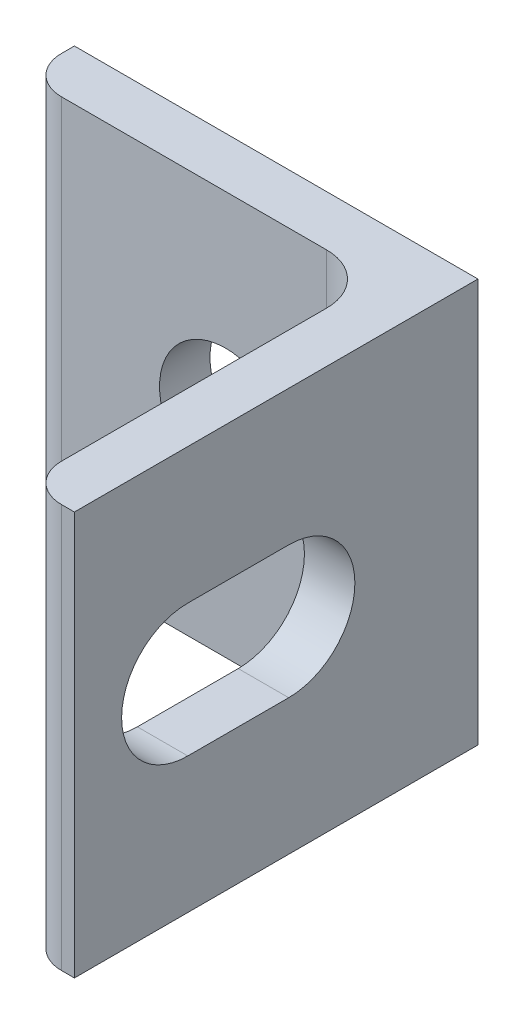
ISO-10303-21;
HEADER;
FILE_DESCRIPTION(('STEP AP214'),'2;1');
FILE_NAME('part.step','',(''),(''),'','','');
FILE_SCHEMA(('AUTOMOTIVE_DESIGN { 1 0 10303 214 1 1 1 1 }'));
ENDSEC;
DATA;
#1=APPLICATION_CONTEXT('core data for automotive mechanical design processes');
#2=APPLICATION_PROTOCOL_DEFINITION('international standard','automotive_design',2000,#1);
#3=PRODUCT_CONTEXT('',#1,'mechanical');
#4=PRODUCT('Part','Part','',(#3));
#5=PRODUCT_RELATED_PRODUCT_CATEGORY('part','',(#4));
#6=PRODUCT_DEFINITION_FORMATION('','',#4);
#7=PRODUCT_DEFINITION_CONTEXT('part definition',#1,'design');
#8=PRODUCT_DEFINITION('design','',#6,#7);
#9=PRODUCT_DEFINITION_SHAPE('','',#8);
#10=(LENGTH_UNIT() NAMED_UNIT(*) SI_UNIT(.MILLI.,.METRE.));
#11=(NAMED_UNIT(*) PLANE_ANGLE_UNIT() SI_UNIT($,.RADIAN.));
#12=(NAMED_UNIT(*) SI_UNIT($,.STERADIAN.) SOLID_ANGLE_UNIT());
#13=UNCERTAINTY_MEASURE_WITH_UNIT(LENGTH_MEASURE(1.E-05),#10,'distance_accuracy_value','');
#14=(GEOMETRIC_REPRESENTATION_CONTEXT(3) GLOBAL_UNCERTAINTY_ASSIGNED_CONTEXT((#13)) GLOBAL_UNIT_ASSIGNED_CONTEXT((#10,
#11,#12)) REPRESENTATION_CONTEXT('',''));
#15=CARTESIAN_POINT('',(0.,0.,0.));
#16=DIRECTION('',(0.,0.,1.));
#17=DIRECTION('',(1.,0.,0.));
#18=AXIS2_PLACEMENT_3D('',#15,#16,#17);
#19=CARTESIAN_POINT('',(-25.4,0.,25.4));
#20=DIRECTION('',(0.,0.,1.));
#21=DIRECTION('',(1.,0.,0.));
#22=AXIS2_PLACEMENT_3D('',#19,#20,#21);
#23=PLANE('',#22);
#24=DIRECTION('',(1.,0.,0.));
#25=VECTOR('',#24,1.);
#26=CARTESIAN_POINT('',(-25.4,0.,25.4));
#27=LINE('',#26,#25);
#28=CARTESIAN_POINT('',(-0.812799999999999,0.,25.4));
#29=VERTEX_POINT('',#28);
#30=CARTESIAN_POINT('',(0.,0.,25.4));
#31=VERTEX_POINT('',#30);
#32=EDGE_CURVE('E192',#29,#31,#27,.T.);
#33=ORIENTED_EDGE('',*,*,#32,.F.);
#34=DIRECTION('',(0.,-1.,0.));
#35=VECTOR('',#34,1.);
#36=CARTESIAN_POINT('',(-0.812799999999999,-25.4,25.4));
#37=LINE('',#36,#35);
#38=CARTESIAN_POINT('',(-0.812799999999999,-25.4,25.4));
#39=VERTEX_POINT('',#38);
#40=EDGE_CURVE('E222',#29,#39,#37,.T.);
#41=ORIENTED_EDGE('',*,*,#40,.T.);
#42=DIRECTION('',(1.,0.,0.));
#43=VECTOR('',#42,1.);
#44=CARTESIAN_POINT('',(-25.4,-25.4,25.4));
#45=LINE('',#44,#43);
#46=CARTESIAN_POINT('',(0.,-25.4,25.4));
#47=VERTEX_POINT('',#46);
#48=EDGE_CURVE('E181',#39,#47,#45,.T.);
#49=ORIENTED_EDGE('',*,*,#48,.T.);
#50=DIRECTION('',(0.,-1.,0.));
#51=VECTOR('',#50,1.);
#52=CARTESIAN_POINT('',(0.,0.,25.4));
#53=LINE('',#52,#51);
#54=EDGE_CURVE('E169',#31,#47,#53,.T.);
#55=ORIENTED_EDGE('',*,*,#54,.F.);
#56=EDGE_LOOP('',(#33,#41,#49,#55));
#57=FACE_BOUND('',#56,.T.);
#58=ADVANCED_FACE('F33',(#57),#23,.T.);
#59=CARTESIAN_POINT('',(-25.4,0.,0.));
#60=DIRECTION('',(0.,1.,0.));
#61=DIRECTION('',(0.,0.,1.));
#62=AXIS2_PLACEMENT_3D('',#59,#60,#61);
#63=PLANE('',#62);
#64=DIRECTION('',(0.,0.,1.));
#65=VECTOR('',#64,1.);
#66=CARTESIAN_POINT('',(-25.4,0.,0.));
#67=LINE('',#66,#65);
#68=CARTESIAN_POINT('',(-25.4,0.,0.));
#69=VERTEX_POINT('',#68);
#70=CARTESIAN_POINT('',(-25.4,0.,0.8128));
#71=VERTEX_POINT('',#70);
#72=EDGE_CURVE('E178',#69,#71,#67,.T.);
#73=ORIENTED_EDGE('',*,*,#72,.T.);
#74=CARTESIAN_POINT('',(-23.0378,0.,0.8128));
#75=DIRECTION('',(0.,1.,0.));
#76=DIRECTION('',(0.,0.,1.));
#77=AXIS2_PLACEMENT_3D('',#74,#75,#76);
#78=CIRCLE('',#77,2.3622);
#79=CARTESIAN_POINT('',(-23.0378,0.,3.175));
#80=VERTEX_POINT('',#79);
#81=EDGE_CURVE('E220',#71,#80,#78,.T.);
#82=ORIENTED_EDGE('',*,*,#81,.T.);
#83=DIRECTION('',(1.,0.,0.));
#84=VECTOR('',#83,1.);
#85=CARTESIAN_POINT('',(-25.4,0.,3.175));
#86=LINE('',#85,#84);
#87=CARTESIAN_POINT('',(-6.35000000000009,0.,3.175));
#88=VERTEX_POINT('',#87);
#89=EDGE_CURVE('E164',#80,#88,#86,.T.);
#90=ORIENTED_EDGE('',*,*,#89,.T.);
#91=CARTESIAN_POINT('',(-6.35000000000009,0.,6.35));
#92=DIRECTION('',(0.,1.,0.));
#93=DIRECTION('',(0.,0.,1.));
#94=AXIS2_PLACEMENT_3D('',#91,#92,#93);
#95=CIRCLE('',#94,3.175);
#96=CARTESIAN_POINT('',(-3.17500000000009,0.,6.34999999999998));
#97=VERTEX_POINT('',#96);
#98=EDGE_CURVE('E11',#88,#97,#95,.F.);
#99=ORIENTED_EDGE('',*,*,#98,.T.);
#100=DIRECTION('',(0.,0.,1.));
#101=VECTOR('',#100,1.);
#102=CARTESIAN_POINT('',(-3.17500000000011,0.,3.175));
#103=LINE('',#102,#101);
#104=CARTESIAN_POINT('',(-3.175,0.,23.0378));
#105=VERTEX_POINT('',#104);
#106=EDGE_CURVE('E166',#97,#105,#103,.T.);
#107=ORIENTED_EDGE('',*,*,#106,.T.);
#108=CARTESIAN_POINT('',(-0.812799999999999,0.,23.0378));
#109=DIRECTION('',(0.,1.,0.));
#110=DIRECTION('',(0.,0.,1.));
#111=AXIS2_PLACEMENT_3D('',#108,#109,#110);
#112=CIRCLE('',#111,2.3622);
#113=EDGE_CURVE('E218',#105,#29,#112,.T.);
#114=ORIENTED_EDGE('',*,*,#113,.T.);
#115=ORIENTED_EDGE('',*,*,#32,.T.);
#116=DIRECTION('',(0.,0.,1.));
#117=VECTOR('',#116,1.);
#118=CARTESIAN_POINT('',(0.,0.,0.));
#119=LINE('',#118,#117);
#120=CARTESIAN_POINT('',(0.,0.,0.));
#121=VERTEX_POINT('',#120);
#122=EDGE_CURVE('E175',#121,#31,#119,.T.);
#123=ORIENTED_EDGE('',*,*,#122,.F.);
#124=DIRECTION('',(1.,0.,0.));
#125=VECTOR('',#124,1.);
#126=CARTESIAN_POINT('',(-25.4,0.,0.));
#127=LINE('',#126,#125);
#128=EDGE_CURVE('E195',#69,#121,#127,.T.);
#129=ORIENTED_EDGE('',*,*,#128,.F.);
#130=EDGE_LOOP('',(#73,#82,#90,#99,#107,#114,#115,#123,#129));
#131=FACE_BOUND('',#130,.T.);
#132=ADVANCED_FACE('F247',(#131),#63,.T.);
#133=CARTESIAN_POINT('',(-25.4,-25.4,0.));
#134=DIRECTION('',(0.,0.,-1.));
#135=DIRECTION('',(0.,1.,0.));
#136=AXIS2_PLACEMENT_3D('',#133,#134,#135);
#137=PLANE('',#136);
#138=CARTESIAN_POINT('',(-12.7,-12.7,0.));
#139=DIRECTION('',(0.,0.,1.));
#140=DIRECTION('',(1.,0.,0.));
#141=AXIS2_PLACEMENT_3D('',#138,#139,#140);
#142=CIRCLE('',#141,4.16560000000001);
#143=CARTESIAN_POINT('',(-8.53439999999999,-12.7,0.));
#144=VERTEX_POINT('',#143);
#145=EDGE_CURVE('E318',#144,#144,#142,.T.);
#146=ORIENTED_EDGE('',*,*,#145,.T.);
#147=EDGE_LOOP('',(#146));
#148=FACE_BOUND('',#147,.T.);
#149=DIRECTION('',(0.,1.,0.));
#150=VECTOR('',#149,1.);
#151=CARTESIAN_POINT('',(0.,-25.4,0.));
#152=LINE('',#151,#150);
#153=CARTESIAN_POINT('',(0.,-25.4,0.));
#154=VERTEX_POINT('',#153);
#155=EDGE_CURVE('E187',#154,#121,#152,.T.);
#156=ORIENTED_EDGE('',*,*,#155,.F.);
#157=DIRECTION('',(1.,0.,0.));
#158=VECTOR('',#157,1.);
#159=CARTESIAN_POINT('',(-25.4,-25.4,0.));
#160=LINE('',#159,#158);
#161=CARTESIAN_POINT('',(-25.4,-25.4,0.));
#162=VERTEX_POINT('',#161);
#163=EDGE_CURVE('E197',#162,#154,#160,.T.);
#164=ORIENTED_EDGE('',*,*,#163,.F.);
#165=DIRECTION('',(0.,1.,0.));
#166=VECTOR('',#165,1.);
#167=CARTESIAN_POINT('',(-25.4,-25.4,0.));
#168=LINE('',#167,#166);
#169=EDGE_CURVE('E174',#162,#69,#168,.T.);
#170=ORIENTED_EDGE('',*,*,#169,.T.);
#171=ORIENTED_EDGE('',*,*,#128,.T.);
#172=EDGE_LOOP('',(#156,#164,#170,#171));
#173=FACE_BOUND('',#172,.T.);
#174=ADVANCED_FACE('F257',(#148,#173),#137,.T.);
#175=CARTESIAN_POINT('',(-25.4,-25.4,25.4));
#176=DIRECTION('',(0.,-1.,0.));
#177=DIRECTION('',(0.,0.,-1.));
#178=AXIS2_PLACEMENT_3D('',#175,#176,#177);
#179=PLANE('',#178);
#180=DIRECTION('',(1.,0.,0.));
#181=VECTOR('',#180,1.);
#182=CARTESIAN_POINT('',(-25.4,-25.4,3.175));
#183=LINE('',#182,#181);
#184=CARTESIAN_POINT('',(-23.0378,-25.4,3.175));
#185=VERTEX_POINT('',#184);
#186=CARTESIAN_POINT('',(-6.35000000000009,-25.4,3.175));
#187=VERTEX_POINT('',#186);
#188=EDGE_CURVE('E161',#185,#187,#183,.T.);
#189=ORIENTED_EDGE('',*,*,#188,.F.);
#190=CARTESIAN_POINT('',(-23.0378,-25.4,0.8128));
#191=DIRECTION('',(0.,-1.,0.));
#192=DIRECTION('',(0.,0.,-1.));
#193=AXIS2_PLACEMENT_3D('',#190,#191,#192);
#194=CIRCLE('',#193,2.3622);
#195=CARTESIAN_POINT('',(-25.4,-25.4,0.812799999999999));
#196=VERTEX_POINT('',#195);
#197=EDGE_CURVE('E214',#185,#196,#194,.T.);
#198=ORIENTED_EDGE('',*,*,#197,.T.);
#199=DIRECTION('',(0.,0.,-1.));
#200=VECTOR('',#199,1.);
#201=CARTESIAN_POINT('',(-25.4,-25.4,25.4));
#202=LINE('',#201,#200);
#203=EDGE_CURVE('E172',#196,#162,#202,.T.);
#204=ORIENTED_EDGE('',*,*,#203,.T.);
#205=ORIENTED_EDGE('',*,*,#163,.T.);
#206=DIRECTION('',(0.,0.,-1.));
#207=VECTOR('',#206,1.);
#208=CARTESIAN_POINT('',(0.,-25.4,25.4));
#209=LINE('',#208,#207);
#210=EDGE_CURVE('E184',#47,#154,#209,.T.);
#211=ORIENTED_EDGE('',*,*,#210,.F.);
#212=ORIENTED_EDGE('',*,*,#48,.F.);
#213=CARTESIAN_POINT('',(-0.812799999999999,-25.4,23.0378));
#214=DIRECTION('',(0.,-1.,0.));
#215=DIRECTION('',(0.,0.,-1.));
#216=AXIS2_PLACEMENT_3D('',#213,#214,#215);
#217=CIRCLE('',#216,2.3622);
#218=CARTESIAN_POINT('',(-3.175,-25.4,23.0378));
#219=VERTEX_POINT('',#218);
#220=EDGE_CURVE('E211',#39,#219,#217,.T.);
#221=ORIENTED_EDGE('',*,*,#220,.T.);
#222=DIRECTION('',(0.,0.,1.));
#223=VECTOR('',#222,1.);
#224=CARTESIAN_POINT('',(-3.17500000000011,-25.4,3.175));
#225=LINE('',#224,#223);
#226=CARTESIAN_POINT('',(-3.17500000000009,-25.4,6.34999999999998));
#227=VERTEX_POINT('',#226);
#228=EDGE_CURVE('E167',#227,#219,#225,.T.);
#229=ORIENTED_EDGE('',*,*,#228,.F.);
#230=CARTESIAN_POINT('',(-6.35000000000009,-25.4,6.35));
#231=DIRECTION('',(0.,-1.,0.));
#232=DIRECTION('',(0.,0.,-1.));
#233=AXIS2_PLACEMENT_3D('',#230,#231,#232);
#234=CIRCLE('',#233,3.175);
#235=EDGE_CURVE('E41',#227,#187,#234,.F.);
#236=ORIENTED_EDGE('',*,*,#235,.T.);
#237=EDGE_LOOP('',(#189,#198,#204,#205,#211,#212,#221,#229,#236));
#238=FACE_BOUND('',#237,.T.);
#239=ADVANCED_FACE('F237',(#238),#179,.T.);
#240=CARTESIAN_POINT('',(-25.4,-25.4,25.4));
#241=DIRECTION('',(1.,0.,0.));
#242=DIRECTION('',(0.,0.,-1.));
#243=AXIS2_PLACEMENT_3D('',#240,#241,#242);
#244=PLANE('',#243);
#245=ORIENTED_EDGE('',*,*,#203,.F.);
#246=DIRECTION('',(0.,-1.,0.));
#247=VECTOR('',#246,1.);
#248=CARTESIAN_POINT('',(-25.4,-25.4,0.812799999999999));
#249=LINE('',#248,#247);
#250=EDGE_CURVE('E216',#196,#71,#249,.F.);
#251=ORIENTED_EDGE('',*,*,#250,.T.);
#252=ORIENTED_EDGE('',*,*,#72,.F.);
#253=ORIENTED_EDGE('',*,*,#169,.F.);
#254=EDGE_LOOP('',(#245,#251,#252,#253));
#255=FACE_BOUND('',#254,.T.);
#256=ADVANCED_FACE('F260',(#255),#244,.F.);
#257=CARTESIAN_POINT('',(0.,-25.4,25.4));
#258=DIRECTION('',(1.,0.,0.));
#259=DIRECTION('',(0.,0.,-1.));
#260=AXIS2_PLACEMENT_3D('',#257,#258,#259);
#261=PLANE('',#260);
#262=CARTESIAN_POINT('',(0.,-12.7,18.2626));
#263=DIRECTION('',(1.,0.,0.));
#264=DIRECTION('',(0.,1.,0.));
#265=AXIS2_PLACEMENT_3D('',#262,#263,#264);
#266=CIRCLE('',#265,4.1656);
#267=CARTESIAN_POINT('',(0.,-8.5344,18.2626));
#268=VERTEX_POINT('',#267);
#269=CARTESIAN_POINT('',(0.,-16.8656,18.2626));
#270=VERTEX_POINT('',#269);
#271=EDGE_CURVE('E149',#268,#270,#266,.T.);
#272=ORIENTED_EDGE('',*,*,#271,.F.);
#273=DIRECTION('',(0.,0.,1.));
#274=VECTOR('',#273,1.);
#275=CARTESIAN_POINT('',(0.,-8.5344,11.9126));
#276=LINE('',#275,#274);
#277=CARTESIAN_POINT('',(0.,-8.5344,11.9126));
#278=VERTEX_POINT('',#277);
#279=EDGE_CURVE('E154',#278,#268,#276,.T.);
#280=ORIENTED_EDGE('',*,*,#279,.F.);
#281=CARTESIAN_POINT('',(0.,-12.7,11.9126));
#282=DIRECTION('',(1.,0.,0.));
#283=DIRECTION('',(0.,1.,0.));
#284=AXIS2_PLACEMENT_3D('',#281,#282,#283);
#285=CIRCLE('',#284,4.1656);
#286=CARTESIAN_POINT('',(0.,-16.8656,11.9126));
#287=VERTEX_POINT('',#286);
#288=EDGE_CURVE('E133',#287,#278,#285,.T.);
#289=ORIENTED_EDGE('',*,*,#288,.F.);
#290=DIRECTION('',(0.,0.,-1.));
#291=VECTOR('',#290,1.);
#292=CARTESIAN_POINT('',(0.,-16.8656,18.2626));
#293=LINE('',#292,#291);
#294=EDGE_CURVE('E144',#270,#287,#293,.T.);
#295=ORIENTED_EDGE('',*,*,#294,.F.);
#296=EDGE_LOOP('',(#272,#280,#289,#295));
#297=FACE_BOUND('',#296,.T.);
#298=ORIENTED_EDGE('',*,*,#54,.T.);
#299=ORIENTED_EDGE('',*,*,#210,.T.);
#300=ORIENTED_EDGE('',*,*,#155,.T.);
#301=ORIENTED_EDGE('',*,*,#122,.T.);
#302=EDGE_LOOP('',(#298,#299,#300,#301));
#303=FACE_BOUND('',#302,.T.);
#304=ADVANCED_FACE('F151',(#297,#303),#261,.T.);
#305=CARTESIAN_POINT('',(-3.17500000000011,0.,3.175));
#306=DIRECTION('',(1.,0.,0.));
#307=DIRECTION('',(0.,0.,-1.));
#308=AXIS2_PLACEMENT_3D('',#305,#306,#307);
#309=PLANE('',#308);
#310=DIRECTION('',(0.,0.,1.));
#311=VECTOR('',#310,1.);
#312=CARTESIAN_POINT('',(-3.17500000000011,-8.5344,3.175));
#313=LINE('',#312,#311);
#314=CARTESIAN_POINT('',(-3.17500000000008,-8.5344,11.9126));
#315=VERTEX_POINT('',#314);
#316=CARTESIAN_POINT('',(-3.17500000000004,-8.5344,18.2626));
#317=VERTEX_POINT('',#316);
#318=EDGE_CURVE('E202',#315,#317,#313,.T.);
#319=ORIENTED_EDGE('',*,*,#318,.T.);
#320=CARTESIAN_POINT('',(-3.17500000000003,-12.7,18.2626));
#321=DIRECTION('',(1.,0.,0.));
#322=DIRECTION('',(0.,0.,-1.));
#323=AXIS2_PLACEMENT_3D('',#320,#321,#322);
#324=CIRCLE('',#323,4.1656);
#325=CARTESIAN_POINT('',(-3.17500000000004,-16.8656,18.2626));
#326=VERTEX_POINT('',#325);
#327=EDGE_CURVE('E205',#317,#326,#324,.T.);
#328=ORIENTED_EDGE('',*,*,#327,.T.);
#329=DIRECTION('',(0.,0.,-1.));
#330=VECTOR('',#329,1.);
#331=CARTESIAN_POINT('',(-3.17500000000011,-16.8656,3.175));
#332=LINE('',#331,#330);
#333=CARTESIAN_POINT('',(-3.17500000000006,-16.8656,11.9126));
#334=VERTEX_POINT('',#333);
#335=EDGE_CURVE('E194',#326,#334,#332,.T.);
#336=ORIENTED_EDGE('',*,*,#335,.T.);
#337=CARTESIAN_POINT('',(-3.17500000000006,-12.7,11.9126));
#338=DIRECTION('',(1.,0.,0.));
#339=DIRECTION('',(0.,0.,-1.));
#340=AXIS2_PLACEMENT_3D('',#337,#338,#339);
#341=CIRCLE('',#340,4.1656);
#342=EDGE_CURVE('E136',#334,#315,#341,.T.);
#343=ORIENTED_EDGE('',*,*,#342,.T.);
#344=EDGE_LOOP('',(#319,#328,#336,#343));
#345=FACE_BOUND('',#344,.T.);
#346=ORIENTED_EDGE('',*,*,#106,.F.);
#347=DIRECTION('',(0.,-1.,0.));
#348=VECTOR('',#347,1.);
#349=CARTESIAN_POINT('',(-3.17500000000009,-25.4,6.34999999999998));
#350=LINE('',#349,#348);
#351=EDGE_CURVE('E228',#97,#227,#350,.T.);
#352=ORIENTED_EDGE('',*,*,#351,.T.);
#353=ORIENTED_EDGE('',*,*,#228,.T.);
#354=DIRECTION('',(0.,-1.,0.));
#355=VECTOR('',#354,1.);
#356=CARTESIAN_POINT('',(-3.175,0.,23.0378));
#357=LINE('',#356,#355);
#358=EDGE_CURVE('E225',#219,#105,#357,.F.);
#359=ORIENTED_EDGE('',*,*,#358,.T.);
#360=EDGE_LOOP('',(#346,#352,#353,#359));
#361=FACE_BOUND('',#360,.T.);
#362=ADVANCED_FACE('F234',(#345,#361),#309,.F.);
#363=CARTESIAN_POINT('',(-25.4,0.,3.175));
#364=DIRECTION('',(0.,0.,-1.));
#365=DIRECTION('',(-1.,0.,0.));
#366=AXIS2_PLACEMENT_3D('',#363,#364,#365);
#367=PLANE('',#366);
#368=CARTESIAN_POINT('',(-12.7,-12.7,3.175));
#369=DIRECTION('',(0.,0.,1.));
#370=DIRECTION('',(1.,0.,0.));
#371=AXIS2_PLACEMENT_3D('',#368,#369,#370);
#372=CIRCLE('',#371,4.16560000000001);
#373=CARTESIAN_POINT('',(-8.53439999999999,-12.7,3.175));
#374=VERTEX_POINT('',#373);
#375=EDGE_CURVE('E319',#374,#374,#372,.T.);
#376=ORIENTED_EDGE('',*,*,#375,.F.);
#377=EDGE_LOOP('',(#376));
#378=FACE_BOUND('',#377,.T.);
#379=ORIENTED_EDGE('',*,*,#188,.T.);
#380=DIRECTION('',(0.,-1.,0.));
#381=VECTOR('',#380,1.);
#382=CARTESIAN_POINT('',(-6.35000000000009,0.,3.175));
#383=LINE('',#382,#381);
#384=EDGE_CURVE('E54',#187,#88,#383,.F.);
#385=ORIENTED_EDGE('',*,*,#384,.T.);
#386=ORIENTED_EDGE('',*,*,#89,.F.);
#387=DIRECTION('',(0.,-1.,0.));
#388=VECTOR('',#387,1.);
#389=CARTESIAN_POINT('',(-23.0378,0.,3.175));
#390=LINE('',#389,#388);
#391=EDGE_CURVE('E208',#80,#185,#390,.T.);
#392=ORIENTED_EDGE('',*,*,#391,.T.);
#393=EDGE_LOOP('',(#379,#385,#386,#392));
#394=FACE_BOUND('',#393,.T.);
#395=ADVANCED_FACE('F265',(#378,#394),#367,.F.);
#396=CARTESIAN_POINT('',(-25.4,-12.7,18.2626));
#397=DIRECTION('',(1.,0.,0.));
#398=DIRECTION('',(0.,1.,0.));
#399=AXIS2_PLACEMENT_3D('',#396,#397,#398);
#400=CYLINDRICAL_SURFACE('',#399,4.1656);
#401=DIRECTION('',(1.,0.,0.));
#402=VECTOR('',#401,1.);
#403=CARTESIAN_POINT('',(-25.4,-8.5344,18.2626));
#404=LINE('',#403,#402);
#405=EDGE_CURVE('E159',#317,#268,#404,.T.);
#406=ORIENTED_EDGE('',*,*,#405,.T.);
#407=ORIENTED_EDGE('',*,*,#271,.T.);
#408=DIRECTION('',(1.,0.,0.));
#409=VECTOR('',#408,1.);
#410=CARTESIAN_POINT('',(-25.4,-16.8656,18.2626));
#411=LINE('',#410,#409);
#412=EDGE_CURVE('E140',#326,#270,#411,.T.);
#413=ORIENTED_EDGE('',*,*,#412,.F.);
#414=ORIENTED_EDGE('',*,*,#327,.F.);
#415=EDGE_LOOP('',(#406,#407,#413,#414));
#416=FACE_BOUND('',#415,.T.);
#417=ADVANCED_FACE('F296',(#416),#400,.F.);
#418=CARTESIAN_POINT('',(-25.4,-8.5344,11.9126));
#419=DIRECTION('',(0.,1.,0.));
#420=DIRECTION('',(-1.,0.,0.));
#421=AXIS2_PLACEMENT_3D('',#418,#419,#420);
#422=PLANE('',#421);
#423=DIRECTION('',(1.,0.,0.));
#424=VECTOR('',#423,1.);
#425=CARTESIAN_POINT('',(-25.4,-8.5344,11.9126));
#426=LINE('',#425,#424);
#427=EDGE_CURVE('E139',#315,#278,#426,.T.);
#428=ORIENTED_EDGE('',*,*,#427,.T.);
#429=ORIENTED_EDGE('',*,*,#279,.T.);
#430=ORIENTED_EDGE('',*,*,#405,.F.);
#431=ORIENTED_EDGE('',*,*,#318,.F.);
#432=EDGE_LOOP('',(#428,#429,#430,#431));
#433=FACE_BOUND('',#432,.T.);
#434=ADVANCED_FACE('F293',(#433),#422,.F.);
#435=CARTESIAN_POINT('',(-25.4,-12.7,11.9126));
#436=DIRECTION('',(1.,0.,0.));
#437=DIRECTION('',(0.,1.,0.));
#438=AXIS2_PLACEMENT_3D('',#435,#436,#437);
#439=CYLINDRICAL_SURFACE('',#438,4.1656);
#440=DIRECTION('',(1.,0.,0.));
#441=VECTOR('',#440,1.);
#442=CARTESIAN_POINT('',(-25.4,-16.8656,11.9126));
#443=LINE('',#442,#441);
#444=EDGE_CURVE('E128',#334,#287,#443,.T.);
#445=ORIENTED_EDGE('',*,*,#444,.T.);
#446=ORIENTED_EDGE('',*,*,#288,.T.);
#447=ORIENTED_EDGE('',*,*,#427,.F.);
#448=ORIENTED_EDGE('',*,*,#342,.F.);
#449=EDGE_LOOP('',(#445,#446,#447,#448));
#450=FACE_BOUND('',#449,.T.);
#451=ADVANCED_FACE('F130',(#450),#439,.F.);
#452=CARTESIAN_POINT('',(-25.4,-16.8656,18.2626));
#453=DIRECTION('',(0.,-1.,0.));
#454=DIRECTION('',(1.,0.,0.));
#455=AXIS2_PLACEMENT_3D('',#452,#453,#454);
#456=PLANE('',#455);
#457=ORIENTED_EDGE('',*,*,#412,.T.);
#458=ORIENTED_EDGE('',*,*,#294,.T.);
#459=ORIENTED_EDGE('',*,*,#444,.F.);
#460=ORIENTED_EDGE('',*,*,#335,.F.);
#461=EDGE_LOOP('',(#457,#458,#459,#460));
#462=FACE_BOUND('',#461,.T.);
#463=ADVANCED_FACE('F145',(#462),#456,.F.);
#464=CARTESIAN_POINT('',(-12.7,-12.7,3.175));
#465=DIRECTION('',(0.,0.,1.));
#466=DIRECTION('',(1.,0.,0.));
#467=AXIS2_PLACEMENT_3D('',#464,#465,#466);
#468=CYLINDRICAL_SURFACE('',#467,4.16560000000001);
#469=ORIENTED_EDGE('',*,*,#145,.F.);
#470=EDGE_LOOP('',(#469));
#471=FACE_BOUND('',#470,.T.);
#472=ORIENTED_EDGE('',*,*,#375,.T.);
#473=EDGE_LOOP('',(#472));
#474=FACE_BOUND('',#473,.T.);
#475=ADVANCED_FACE('F280',(#471,#474),#468,.F.);
#476=CARTESIAN_POINT('',(-23.0378,0.,0.8128));
#477=DIRECTION('',(0.,-1.,0.));
#478=DIRECTION('',(0.,0.,-1.));
#479=AXIS2_PLACEMENT_3D('',#476,#477,#478);
#480=CYLINDRICAL_SURFACE('',#479,2.3622);
#481=ORIENTED_EDGE('',*,*,#81,.F.);
#482=ORIENTED_EDGE('',*,*,#250,.F.);
#483=ORIENTED_EDGE('',*,*,#197,.F.);
#484=ORIENTED_EDGE('',*,*,#391,.F.);
#485=EDGE_LOOP('',(#481,#482,#483,#484));
#486=FACE_BOUND('',#485,.T.);
#487=ADVANCED_FACE('F263',(#486),#480,.T.);
#488=CARTESIAN_POINT('',(-0.812799999999999,0.,23.0378));
#489=DIRECTION('',(0.,1.,0.));
#490=DIRECTION('',(0.,0.,1.));
#491=AXIS2_PLACEMENT_3D('',#488,#489,#490);
#492=CYLINDRICAL_SURFACE('',#491,2.3622);
#493=ORIENTED_EDGE('',*,*,#113,.F.);
#494=ORIENTED_EDGE('',*,*,#358,.F.);
#495=ORIENTED_EDGE('',*,*,#220,.F.);
#496=ORIENTED_EDGE('',*,*,#40,.F.);
#497=EDGE_LOOP('',(#493,#494,#495,#496));
#498=FACE_BOUND('',#497,.T.);
#499=ADVANCED_FACE('F244',(#498),#492,.T.);
#500=CARTESIAN_POINT('',(-6.35000000000009,0.,6.35));
#501=DIRECTION('',(0.,1.,0.));
#502=DIRECTION('',(0.,0.,1.));
#503=AXIS2_PLACEMENT_3D('',#500,#501,#502);
#504=CYLINDRICAL_SURFACE('',#503,3.175);
#505=ORIENTED_EDGE('',*,*,#98,.F.);
#506=ORIENTED_EDGE('',*,*,#384,.F.);
#507=ORIENTED_EDGE('',*,*,#235,.F.);
#508=ORIENTED_EDGE('',*,*,#351,.F.);
#509=EDGE_LOOP('',(#505,#506,#507,#508));
#510=FACE_BOUND('',#509,.T.);
#511=ADVANCED_FACE('F35',(#510),#504,.F.);
#512=CLOSED_SHELL('',(#58,#132,#174,#239,#256,#304,#362,#395,#417,#434,#451,#463,#475,#487,#499,#511));
#513=MANIFOLD_SOLID_BREP('B2',#512);
#514=ADVANCED_BREP_SHAPE_REPRESENTATION('',(#18,#513),#14);
#515=SHAPE_DEFINITION_REPRESENTATION(#9,#514);
ENDSEC;
END-ISO-10303-21;
